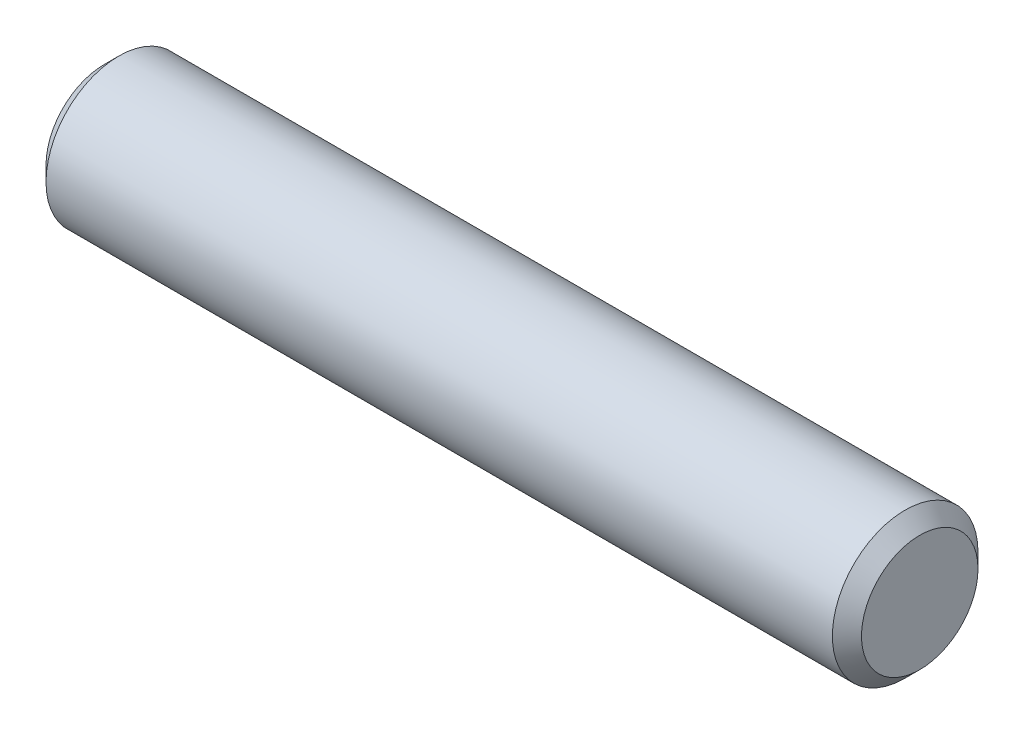
ISO-10303-21;
HEADER;
FILE_DESCRIPTION(('STEP AP214'),'2;1');
FILE_NAME('part.step','',(''),(''),'','','');
FILE_SCHEMA(('AUTOMOTIVE_DESIGN { 1 0 10303 214 1 1 1 1 }'));
ENDSEC;
DATA;
#1=APPLICATION_CONTEXT('core data for automotive mechanical design processes');
#2=APPLICATION_PROTOCOL_DEFINITION('international standard','automotive_design',2000,#1);
#3=PRODUCT_CONTEXT('',#1,'mechanical');
#4=PRODUCT('Part','Part','',(#3));
#5=PRODUCT_RELATED_PRODUCT_CATEGORY('part','',(#4));
#6=PRODUCT_DEFINITION_FORMATION('','',#4);
#7=PRODUCT_DEFINITION_CONTEXT('part definition',#1,'design');
#8=PRODUCT_DEFINITION('design','',#6,#7);
#9=PRODUCT_DEFINITION_SHAPE('','',#8);
#10=(LENGTH_UNIT() NAMED_UNIT(*) SI_UNIT(.MILLI.,.METRE.));
#11=(NAMED_UNIT(*) PLANE_ANGLE_UNIT() SI_UNIT($,.RADIAN.));
#12=(NAMED_UNIT(*) SI_UNIT($,.STERADIAN.) SOLID_ANGLE_UNIT());
#13=UNCERTAINTY_MEASURE_WITH_UNIT(LENGTH_MEASURE(1.E-05),#10,'distance_accuracy_value','');
#14=(GEOMETRIC_REPRESENTATION_CONTEXT(3) GLOBAL_UNCERTAINTY_ASSIGNED_CONTEXT((#13)) GLOBAL_UNIT_ASSIGNED_CONTEXT((#10,
#11,#12)) REPRESENTATION_CONTEXT('',''));
#15=CARTESIAN_POINT('',(0.,0.,0.));
#16=DIRECTION('',(0.,0.,1.));
#17=DIRECTION('',(1.,0.,0.));
#18=AXIS2_PLACEMENT_3D('',#15,#16,#17);
#19=CARTESIAN_POINT('',(0.,0.,0.));
#20=DIRECTION('',(1.,0.,0.));
#21=DIRECTION('',(0.,0.,-1.));
#22=AXIS2_PLACEMENT_3D('',#19,#20,#21);
#23=PLANE('',#22);
#24=CARTESIAN_POINT('',(0.,0.,0.));
#25=DIRECTION('',(1.,0.,0.));
#26=DIRECTION('',(0.,0.,-1.));
#27=AXIS2_PLACEMENT_3D('',#24,#25,#26);
#28=CIRCLE('',#27,2.);
#29=CARTESIAN_POINT('',(0.,0.,-2.));
#30=VERTEX_POINT('',#29);
#31=EDGE_CURVE('E58',#30,#30,#28,.T.);
#32=ORIENTED_EDGE('',*,*,#31,.T.);
#33=EDGE_LOOP('',(#32));
#34=FACE_BOUND('',#33,.T.);
#35=ADVANCED_FACE('F39',(#34),#23,.T.);
#36=CARTESIAN_POINT('',(0.,0.,0.));
#37=DIRECTION('',(1.,0.,0.));
#38=DIRECTION('',(0.,0.,-1.));
#39=AXIS2_PLACEMENT_3D('',#36,#37,#38);
#40=CYLINDRICAL_SURFACE('',#39,2.5);
#41=CARTESIAN_POINT('',(-0.500000000000002,0.,0.));
#42=DIRECTION('',(1.,0.,0.));
#43=DIRECTION('',(0.,0.,-1.));
#44=AXIS2_PLACEMENT_3D('',#41,#42,#43);
#45=CIRCLE('',#44,2.5);
#46=CARTESIAN_POINT('',(-0.500000000000002,0.,-2.5));
#47=VERTEX_POINT('',#46);
#48=EDGE_CURVE('E48',#47,#47,#45,.F.);
#49=ORIENTED_EDGE('',*,*,#48,.T.);
#50=EDGE_LOOP('',(#49));
#51=FACE_BOUND('',#50,.T.);
#52=CARTESIAN_POINT('',(-27.5,0.,0.));
#53=DIRECTION('',(-1.,0.,0.));
#54=DIRECTION('',(0.,0.,1.));
#55=AXIS2_PLACEMENT_3D('',#52,#53,#54);
#56=CIRCLE('',#55,2.5);
#57=CARTESIAN_POINT('',(-27.5,0.,2.5));
#58=VERTEX_POINT('',#57);
#59=EDGE_CURVE('E53',#58,#58,#56,.F.);
#60=ORIENTED_EDGE('',*,*,#59,.T.);
#61=EDGE_LOOP('',(#60));
#62=FACE_BOUND('',#61,.T.);
#63=ADVANCED_FACE('F75',(#51,#62),#40,.T.);
#64=CARTESIAN_POINT('',(-28.,0.,0.));
#65=DIRECTION('',(-1.,0.,0.));
#66=DIRECTION('',(0.,0.,1.));
#67=AXIS2_PLACEMENT_3D('',#64,#65,#66);
#68=PLANE('',#67);
#69=CARTESIAN_POINT('',(-28.,0.,0.));
#70=DIRECTION('',(-1.,0.,0.));
#71=DIRECTION('',(0.,0.,1.));
#72=AXIS2_PLACEMENT_3D('',#69,#70,#71);
#73=CIRCLE('',#72,1.99999999999999);
#74=CARTESIAN_POINT('',(-28.,0.,1.99999999999999));
#75=VERTEX_POINT('',#74);
#76=EDGE_CURVE('E10',#75,#75,#73,.T.);
#77=ORIENTED_EDGE('',*,*,#76,.T.);
#78=EDGE_LOOP('',(#77));
#79=FACE_BOUND('',#78,.T.);
#80=ADVANCED_FACE('F68',(#79),#68,.T.);
#81=CARTESIAN_POINT('',(0.,0.,0.));
#82=DIRECTION('',(-1.,0.,0.));
#83=DIRECTION('',(0.,0.,1.));
#84=AXIS2_PLACEMENT_3D('',#81,#82,#83);
#85=CONICAL_SURFACE('',#84,2.,0.785398163397447);
#86=ORIENTED_EDGE('',*,*,#48,.F.);
#87=EDGE_LOOP('',(#86));
#88=FACE_BOUND('',#87,.T.);
#89=ORIENTED_EDGE('',*,*,#31,.F.);
#90=EDGE_LOOP('',(#89));
#91=FACE_BOUND('',#90,.T.);
#92=ADVANCED_FACE('F66',(#88,#91),#85,.T.);
#93=CARTESIAN_POINT('',(-27.5,0.,0.));
#94=DIRECTION('',(1.,0.,0.));
#95=DIRECTION('',(0.,0.,-1.));
#96=AXIS2_PLACEMENT_3D('',#93,#94,#95);
#97=CONICAL_SURFACE('',#96,2.5,0.785398163397455);
#98=ORIENTED_EDGE('',*,*,#76,.F.);
#99=EDGE_LOOP('',(#98));
#100=FACE_BOUND('',#99,.T.);
#101=ORIENTED_EDGE('',*,*,#59,.F.);
#102=EDGE_LOOP('',(#101));
#103=FACE_BOUND('',#102,.T.);
#104=ADVANCED_FACE('F42',(#100,#103),#97,.T.);
#105=CLOSED_SHELL('',(#35,#63,#80,#92,#104));
#106=MANIFOLD_SOLID_BREP('B2',#105);
#107=ADVANCED_BREP_SHAPE_REPRESENTATION('',(#18,#106),#14);
#108=SHAPE_DEFINITION_REPRESENTATION(#9,#107);
ENDSEC;
END-ISO-10303-21;
